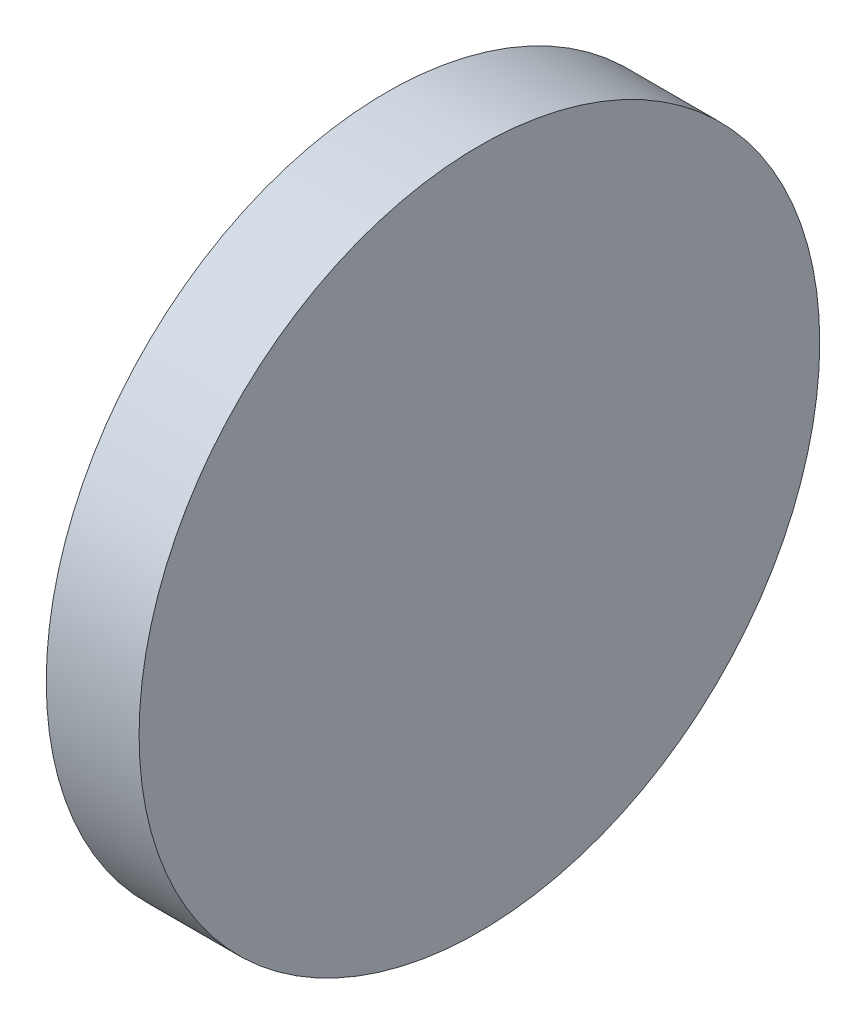
ISO-10303-21;
HEADER;
FILE_DESCRIPTION(('STEP AP214'),'2;1');
FILE_NAME('part.step','',(''),(''),'','','');
FILE_SCHEMA(('AUTOMOTIVE_DESIGN { 1 0 10303 214 1 1 1 1 }'));
ENDSEC;
DATA;
#1=APPLICATION_CONTEXT('core data for automotive mechanical design processes');
#2=APPLICATION_PROTOCOL_DEFINITION('international standard','automotive_design',2000,#1);
#3=PRODUCT_CONTEXT('',#1,'mechanical');
#4=PRODUCT('Part','Part','',(#3));
#5=PRODUCT_RELATED_PRODUCT_CATEGORY('part','',(#4));
#6=PRODUCT_DEFINITION_FORMATION('','',#4);
#7=PRODUCT_DEFINITION_CONTEXT('part definition',#1,'design');
#8=PRODUCT_DEFINITION('design','',#6,#7);
#9=PRODUCT_DEFINITION_SHAPE('','',#8);
#10=(LENGTH_UNIT() NAMED_UNIT(*) SI_UNIT(.MILLI.,.METRE.));
#11=(NAMED_UNIT(*) PLANE_ANGLE_UNIT() SI_UNIT($,.RADIAN.));
#12=(NAMED_UNIT(*) SI_UNIT($,.STERADIAN.) SOLID_ANGLE_UNIT());
#13=UNCERTAINTY_MEASURE_WITH_UNIT(LENGTH_MEASURE(1.E-05),#10,'distance_accuracy_value','');
#14=(GEOMETRIC_REPRESENTATION_CONTEXT(3) GLOBAL_UNCERTAINTY_ASSIGNED_CONTEXT((#13)) GLOBAL_UNIT_ASSIGNED_CONTEXT((#10,
#11,#12)) REPRESENTATION_CONTEXT('',''));
#15=CARTESIAN_POINT('',(0.,0.,0.));
#16=DIRECTION('',(0.,0.,1.));
#17=DIRECTION('',(1.,0.,0.));
#18=AXIS2_PLACEMENT_3D('',#15,#16,#17);
#19=CARTESIAN_POINT('',(15.,0.,0.));
#20=DIRECTION('',(-1.,0.,0.));
#21=DIRECTION('',(0.,0.,1.));
#22=AXIS2_PLACEMENT_3D('',#19,#20,#21);
#23=CYLINDRICAL_SURFACE('',#22,55.);
#24=CARTESIAN_POINT('',(15.,0.,0.));
#25=DIRECTION('',(1.,0.,0.));
#26=DIRECTION('',(0.,0.,-1.));
#27=AXIS2_PLACEMENT_3D('',#24,#25,#26);
#28=CIRCLE('',#27,55.);
#29=CARTESIAN_POINT('',(15.,0.,-55.));
#30=VERTEX_POINT('',#29);
#31=EDGE_CURVE('E10',#30,#30,#28,.T.);
#32=ORIENTED_EDGE('',*,*,#31,.F.);
#33=EDGE_LOOP('',(#32));
#34=FACE_BOUND('',#33,.T.);
#35=CARTESIAN_POINT('',(0.,0.,0.));
#36=DIRECTION('',(1.,0.,0.));
#37=DIRECTION('',(0.,0.,-1.));
#38=AXIS2_PLACEMENT_3D('',#35,#36,#37);
#39=CIRCLE('',#38,55.);
#40=CARTESIAN_POINT('',(0.,0.,-55.));
#41=VERTEX_POINT('',#40);
#42=EDGE_CURVE('E44',#41,#41,#39,.T.);
#43=ORIENTED_EDGE('',*,*,#42,.T.);
#44=EDGE_LOOP('',(#43));
#45=FACE_BOUND('',#44,.T.);
#46=ADVANCED_FACE('F41',(#34,#45),#23,.T.);
#47=CARTESIAN_POINT('',(15.,0.,0.));
#48=DIRECTION('',(1.,0.,0.));
#49=DIRECTION('',(0.,0.,-1.));
#50=AXIS2_PLACEMENT_3D('',#47,#48,#49);
#51=PLANE('',#50);
#52=ORIENTED_EDGE('',*,*,#31,.T.);
#53=EDGE_LOOP('',(#52));
#54=FACE_BOUND('',#53,.T.);
#55=ADVANCED_FACE('F58',(#54),#51,.T.);
#56=CARTESIAN_POINT('',(0.,0.,0.));
#57=DIRECTION('',(1.,0.,0.));
#58=DIRECTION('',(0.,0.,-1.));
#59=AXIS2_PLACEMENT_3D('',#56,#57,#58);
#60=PLANE('',#59);
#61=ORIENTED_EDGE('',*,*,#42,.F.);
#62=EDGE_LOOP('',(#61));
#63=FACE_BOUND('',#62,.T.);
#64=ADVANCED_FACE('F56',(#63),#60,.F.);
#65=CLOSED_SHELL('',(#46,#55,#64));
#66=MANIFOLD_SOLID_BREP('B2',#65);
#67=ADVANCED_BREP_SHAPE_REPRESENTATION('',(#18,#66),#14);
#68=SHAPE_DEFINITION_REPRESENTATION(#9,#67);
ENDSEC;
END-ISO-10303-21;
